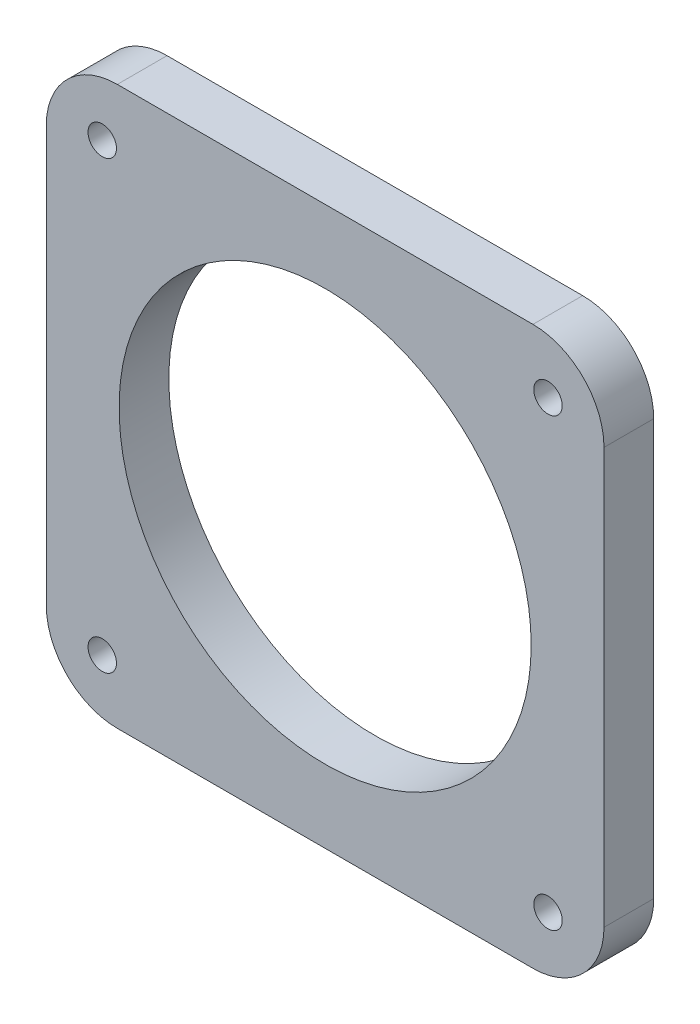
ISO-10303-21;
HEADER;
FILE_DESCRIPTION(('STEP AP214'),'2;1');
FILE_NAME('part.step','',(''),(''),'','','');
FILE_SCHEMA(('AUTOMOTIVE_DESIGN { 1 0 10303 214 1 1 1 1 }'));
ENDSEC;
DATA;
#1=APPLICATION_CONTEXT('core data for automotive mechanical design processes');
#2=APPLICATION_PROTOCOL_DEFINITION('international standard','automotive_design',2000,#1);
#3=PRODUCT_CONTEXT('',#1,'mechanical');
#4=PRODUCT('Part','Part','',(#3));
#5=PRODUCT_RELATED_PRODUCT_CATEGORY('part','',(#4));
#6=PRODUCT_DEFINITION_FORMATION('','',#4);
#7=PRODUCT_DEFINITION_CONTEXT('part definition',#1,'design');
#8=PRODUCT_DEFINITION('design','',#6,#7);
#9=PRODUCT_DEFINITION_SHAPE('','',#8);
#10=(LENGTH_UNIT() NAMED_UNIT(*) SI_UNIT(.MILLI.,.METRE.));
#11=(NAMED_UNIT(*) PLANE_ANGLE_UNIT() SI_UNIT($,.RADIAN.));
#12=(NAMED_UNIT(*) SI_UNIT($,.STERADIAN.) SOLID_ANGLE_UNIT());
#13=UNCERTAINTY_MEASURE_WITH_UNIT(LENGTH_MEASURE(1.E-05),#10,'distance_accuracy_value','');
#14=(GEOMETRIC_REPRESENTATION_CONTEXT(3) GLOBAL_UNCERTAINTY_ASSIGNED_CONTEXT((#13)) GLOBAL_UNIT_ASSIGNED_CONTEXT((#10,
#11,#12)) REPRESENTATION_CONTEXT('',''));
#15=CARTESIAN_POINT('',(0.,0.,0.));
#16=DIRECTION('',(0.,0.,1.));
#17=DIRECTION('',(1.,0.,0.));
#18=AXIS2_PLACEMENT_3D('',#15,#16,#17);
#19=CARTESIAN_POINT('',(39.25,-39.25,3.5));
#20=DIRECTION('',(-1.,0.,0.));
#21=DIRECTION('',(0.,0.,1.));
#22=AXIS2_PLACEMENT_3D('',#19,#20,#21);
#23=PLANE('',#22);
#24=DIRECTION('',(0.,1.,0.));
#25=VECTOR('',#24,1.);
#26=CARTESIAN_POINT('',(39.25,-39.25,3.5));
#27=LINE('',#26,#25);
#28=CARTESIAN_POINT('',(39.25,-29.25,3.5));
#29=VERTEX_POINT('',#28);
#30=CARTESIAN_POINT('',(39.25,29.25,3.5));
#31=VERTEX_POINT('',#30);
#32=EDGE_CURVE('E129',#29,#31,#27,.T.);
#33=ORIENTED_EDGE('',*,*,#32,.F.);
#34=DIRECTION('',(0.,0.,-1.));
#35=VECTOR('',#34,1.);
#36=CARTESIAN_POINT('',(39.25,-29.25,3.5));
#37=LINE('',#36,#35);
#38=CARTESIAN_POINT('',(39.25,-29.25,-3.5));
#39=VERTEX_POINT('',#38);
#40=EDGE_CURVE('E155',#29,#39,#37,.T.);
#41=ORIENTED_EDGE('',*,*,#40,.T.);
#42=DIRECTION('',(0.,1.,0.));
#43=VECTOR('',#42,1.);
#44=CARTESIAN_POINT('',(39.25,-39.25,-3.5));
#45=LINE('',#44,#43);
#46=CARTESIAN_POINT('',(39.25,29.25,-3.5));
#47=VERTEX_POINT('',#46);
#48=EDGE_CURVE('E161',#39,#47,#45,.T.);
#49=ORIENTED_EDGE('',*,*,#48,.T.);
#50=DIRECTION('',(0.,0.,-1.));
#51=VECTOR('',#50,1.);
#52=CARTESIAN_POINT('',(39.25,29.25,3.5));
#53=LINE('',#52,#51);
#54=EDGE_CURVE('E153',#47,#31,#53,.F.);
#55=ORIENTED_EDGE('',*,*,#54,.T.);
#56=EDGE_LOOP('',(#33,#41,#49,#55));
#57=FACE_BOUND('',#56,.T.);
#58=ADVANCED_FACE('F37',(#57),#23,.F.);
#59=CARTESIAN_POINT('',(-39.25,39.25,3.5));
#60=DIRECTION('',(0.,-1.,0.));
#61=DIRECTION('',(0.,0.,-1.));
#62=AXIS2_PLACEMENT_3D('',#59,#60,#61);
#63=PLANE('',#62);
#64=DIRECTION('',(-1.,0.,0.));
#65=VECTOR('',#64,1.);
#66=CARTESIAN_POINT('',(-39.25,39.25,3.5));
#67=LINE('',#66,#65);
#68=CARTESIAN_POINT('',(29.25,39.25,3.5));
#69=VERTEX_POINT('',#68);
#70=CARTESIAN_POINT('',(-29.25,39.25,3.5));
#71=VERTEX_POINT('',#70);
#72=EDGE_CURVE('E132',#69,#71,#67,.T.);
#73=ORIENTED_EDGE('',*,*,#72,.F.);
#74=DIRECTION('',(0.,0.,-1.));
#75=VECTOR('',#74,1.);
#76=CARTESIAN_POINT('',(29.25,39.25,3.5));
#77=LINE('',#76,#75);
#78=CARTESIAN_POINT('',(29.25,39.25,-3.5));
#79=VERTEX_POINT('',#78);
#80=EDGE_CURVE('E11',#69,#79,#77,.T.);
#81=ORIENTED_EDGE('',*,*,#80,.T.);
#82=DIRECTION('',(-1.,0.,0.));
#83=VECTOR('',#82,1.);
#84=CARTESIAN_POINT('',(-39.25,39.25,-3.5));
#85=LINE('',#84,#83);
#86=CARTESIAN_POINT('',(-29.25,39.25,-3.5));
#87=VERTEX_POINT('',#86);
#88=EDGE_CURVE('E134',#79,#87,#85,.T.);
#89=ORIENTED_EDGE('',*,*,#88,.T.);
#90=DIRECTION('',(0.,0.,-1.));
#91=VECTOR('',#90,1.);
#92=CARTESIAN_POINT('',(-29.25,39.25,3.5));
#93=LINE('',#92,#91);
#94=EDGE_CURVE('E45',#87,#71,#93,.F.);
#95=ORIENTED_EDGE('',*,*,#94,.T.);
#96=EDGE_LOOP('',(#73,#81,#89,#95));
#97=FACE_BOUND('',#96,.T.);
#98=ADVANCED_FACE('F230',(#97),#63,.F.);
#99=CARTESIAN_POINT('',(-39.25,-39.25,3.5));
#100=DIRECTION('',(1.,0.,0.));
#101=DIRECTION('',(0.,0.,-1.));
#102=AXIS2_PLACEMENT_3D('',#99,#100,#101);
#103=PLANE('',#102);
#104=DIRECTION('',(0.,-1.,0.));
#105=VECTOR('',#104,1.);
#106=CARTESIAN_POINT('',(-39.25,-39.25,-3.5));
#107=LINE('',#106,#105);
#108=CARTESIAN_POINT('',(-39.25,29.25,-3.5));
#109=VERTEX_POINT('',#108);
#110=CARTESIAN_POINT('',(-39.25,-29.25,-3.5));
#111=VERTEX_POINT('',#110);
#112=EDGE_CURVE('E130',#109,#111,#107,.T.);
#113=ORIENTED_EDGE('',*,*,#112,.T.);
#114=DIRECTION('',(0.,0.,-1.));
#115=VECTOR('',#114,1.);
#116=CARTESIAN_POINT('',(-39.25,-29.25,3.5));
#117=LINE('',#116,#115);
#118=CARTESIAN_POINT('',(-39.25,-29.25,3.5));
#119=VERTEX_POINT('',#118);
#120=EDGE_CURVE('E108',#111,#119,#117,.F.);
#121=ORIENTED_EDGE('',*,*,#120,.T.);
#122=DIRECTION('',(0.,-1.,0.));
#123=VECTOR('',#122,1.);
#124=CARTESIAN_POINT('',(-39.25,-39.25,3.5));
#125=LINE('',#124,#123);
#126=CARTESIAN_POINT('',(-39.25,29.25,3.5));
#127=VERTEX_POINT('',#126);
#128=EDGE_CURVE('E173',#127,#119,#125,.T.);
#129=ORIENTED_EDGE('',*,*,#128,.F.);
#130=DIRECTION('',(0.,0.,-1.));
#131=VECTOR('',#130,1.);
#132=CARTESIAN_POINT('',(-39.25,29.25,3.5));
#133=LINE('',#132,#131);
#134=EDGE_CURVE('E113',#127,#109,#133,.T.);
#135=ORIENTED_EDGE('',*,*,#134,.T.);
#136=EDGE_LOOP('',(#113,#121,#129,#135));
#137=FACE_BOUND('',#136,.T.);
#138=ADVANCED_FACE('F228',(#137),#103,.F.);
#139=CARTESIAN_POINT('',(-39.25,-39.25,3.5));
#140=DIRECTION('',(0.,1.,0.));
#141=DIRECTION('',(0.,0.,1.));
#142=AXIS2_PLACEMENT_3D('',#139,#140,#141);
#143=PLANE('',#142);
#144=DIRECTION('',(1.,0.,0.));
#145=VECTOR('',#144,1.);
#146=CARTESIAN_POINT('',(-39.25,-39.25,3.5));
#147=LINE('',#146,#145);
#148=CARTESIAN_POINT('',(-29.25,-39.25,3.5));
#149=VERTEX_POINT('',#148);
#150=CARTESIAN_POINT('',(29.25,-39.25,3.5));
#151=VERTEX_POINT('',#150);
#152=EDGE_CURVE('E123',#149,#151,#147,.T.);
#153=ORIENTED_EDGE('',*,*,#152,.F.);
#154=DIRECTION('',(0.,0.,-1.));
#155=VECTOR('',#154,1.);
#156=CARTESIAN_POINT('',(-29.25,-39.25,3.5));
#157=LINE('',#156,#155);
#158=CARTESIAN_POINT('',(-29.25,-39.25,-3.5));
#159=VERTEX_POINT('',#158);
#160=EDGE_CURVE('E107',#149,#159,#157,.T.);
#161=ORIENTED_EDGE('',*,*,#160,.T.);
#162=DIRECTION('',(1.,0.,0.));
#163=VECTOR('',#162,1.);
#164=CARTESIAN_POINT('',(-39.25,-39.25,-3.5));
#165=LINE('',#164,#163);
#166=CARTESIAN_POINT('',(29.25,-39.25,-3.5));
#167=VERTEX_POINT('',#166);
#168=EDGE_CURVE('E120',#159,#167,#165,.T.);
#169=ORIENTED_EDGE('',*,*,#168,.T.);
#170=DIRECTION('',(0.,0.,-1.));
#171=VECTOR('',#170,1.);
#172=CARTESIAN_POINT('',(29.25,-39.25,3.5));
#173=LINE('',#172,#171);
#174=EDGE_CURVE('E125',#167,#151,#173,.F.);
#175=ORIENTED_EDGE('',*,*,#174,.T.);
#176=EDGE_LOOP('',(#153,#161,#169,#175));
#177=FACE_BOUND('',#176,.T.);
#178=ADVANCED_FACE('F119',(#177),#143,.F.);
#179=CARTESIAN_POINT('',(0.,0.,3.5));
#180=DIRECTION('',(0.,0.,-1.));
#181=DIRECTION('',(-1.,0.,0.));
#182=AXIS2_PLACEMENT_3D('',#179,#180,#181);
#183=PLANE('',#182);
#184=CARTESIAN_POINT('',(0.,0.,3.5));
#185=DIRECTION('',(0.,0.,1.));
#186=DIRECTION('',(1.,0.,0.));
#187=AXIS2_PLACEMENT_3D('',#184,#185,#186);
#188=CIRCLE('',#187,29.);
#189=CARTESIAN_POINT('',(29.,0.,3.5));
#190=VERTEX_POINT('',#189);
#191=EDGE_CURVE('E198',#190,#190,#188,.T.);
#192=ORIENTED_EDGE('',*,*,#191,.F.);
#193=EDGE_LOOP('',(#192));
#194=FACE_BOUND('',#193,.T.);
#195=CARTESIAN_POINT('',(-31.3713203435598,-31.3713203435595,3.5));
#196=DIRECTION('',(0.,0.,1.));
#197=DIRECTION('',(-1.,0.,0.));
#198=AXIS2_PLACEMENT_3D('',#195,#196,#197);
#199=CIRCLE('',#198,2.);
#200=CARTESIAN_POINT('',(-33.3713203435598,-31.3713203435595,3.5));
#201=VERTEX_POINT('',#200);
#202=EDGE_CURVE('E178',#201,#201,#199,.T.);
#203=ORIENTED_EDGE('',*,*,#202,.F.);
#204=EDGE_LOOP('',(#203));
#205=FACE_BOUND('',#204,.T.);
#206=CARTESIAN_POINT('',(31.3713203435598,31.3713203435595,3.5));
#207=DIRECTION('',(0.,0.,1.));
#208=DIRECTION('',(-1.,0.,0.));
#209=AXIS2_PLACEMENT_3D('',#206,#207,#208);
#210=CIRCLE('',#209,2.);
#211=CARTESIAN_POINT('',(29.3713203435598,31.3713203435595,3.5));
#212=VERTEX_POINT('',#211);
#213=EDGE_CURVE('E183',#212,#212,#210,.T.);
#214=ORIENTED_EDGE('',*,*,#213,.F.);
#215=EDGE_LOOP('',(#214));
#216=FACE_BOUND('',#215,.T.);
#217=CARTESIAN_POINT('',(31.3713203435598,-31.3713203435595,3.5));
#218=DIRECTION('',(0.,0.,1.));
#219=DIRECTION('',(1.,0.,0.));
#220=AXIS2_PLACEMENT_3D('',#217,#218,#219);
#221=CIRCLE('',#220,2.);
#222=CARTESIAN_POINT('',(33.3713203435598,-31.3713203435595,3.5));
#223=VERTEX_POINT('',#222);
#224=EDGE_CURVE('E184',#223,#223,#221,.T.);
#225=ORIENTED_EDGE('',*,*,#224,.F.);
#226=EDGE_LOOP('',(#225));
#227=FACE_BOUND('',#226,.T.);
#228=CARTESIAN_POINT('',(-31.3713203435598,31.3713203435595,3.5));
#229=DIRECTION('',(0.,0.,1.));
#230=DIRECTION('',(1.,0.,0.));
#231=AXIS2_PLACEMENT_3D('',#228,#229,#230);
#232=CIRCLE('',#231,2.);
#233=CARTESIAN_POINT('',(-29.3713203435598,31.3713203435595,3.5));
#234=VERTEX_POINT('',#233);
#235=EDGE_CURVE('E169',#234,#234,#232,.T.);
#236=ORIENTED_EDGE('',*,*,#235,.F.);
#237=EDGE_LOOP('',(#236));
#238=FACE_BOUND('',#237,.T.);
#239=ORIENTED_EDGE('',*,*,#128,.T.);
#240=CARTESIAN_POINT('',(-29.25,-29.25,3.5));
#241=DIRECTION('',(0.,0.,-1.));
#242=DIRECTION('',(-1.,0.,0.));
#243=AXIS2_PLACEMENT_3D('',#240,#241,#242);
#244=CIRCLE('',#243,10.);
#245=EDGE_CURVE('E151',#119,#149,#244,.F.);
#246=ORIENTED_EDGE('',*,*,#245,.T.);
#247=ORIENTED_EDGE('',*,*,#152,.T.);
#248=CARTESIAN_POINT('',(29.25,-29.25,3.5));
#249=DIRECTION('',(0.,0.,-1.));
#250=DIRECTION('',(-1.,0.,0.));
#251=AXIS2_PLACEMENT_3D('',#248,#249,#250);
#252=CIRCLE('',#251,10.);
#253=EDGE_CURVE('E149',#151,#29,#252,.F.);
#254=ORIENTED_EDGE('',*,*,#253,.T.);
#255=ORIENTED_EDGE('',*,*,#32,.T.);
#256=CARTESIAN_POINT('',(29.25,29.25,3.5));
#257=DIRECTION('',(0.,0.,-1.));
#258=DIRECTION('',(-1.,0.,0.));
#259=AXIS2_PLACEMENT_3D('',#256,#257,#258);
#260=CIRCLE('',#259,10.);
#261=EDGE_CURVE('E58',#31,#69,#260,.F.);
#262=ORIENTED_EDGE('',*,*,#261,.T.);
#263=ORIENTED_EDGE('',*,*,#72,.T.);
#264=CARTESIAN_POINT('',(-29.25,29.25,3.5));
#265=DIRECTION('',(0.,0.,-1.));
#266=DIRECTION('',(-1.,0.,0.));
#267=AXIS2_PLACEMENT_3D('',#264,#265,#266);
#268=CIRCLE('',#267,10.);
#269=EDGE_CURVE('E146',#71,#127,#268,.F.);
#270=ORIENTED_EDGE('',*,*,#269,.T.);
#271=EDGE_LOOP('',(#239,#246,#247,#254,#255,#262,#263,#270));
#272=FACE_BOUND('',#271,.T.);
#273=ADVANCED_FACE('F213',(#194,#205,#216,#227,#238,#272),#183,.F.);
#274=CARTESIAN_POINT('',(0.,0.,-3.5));
#275=DIRECTION('',(0.,0.,-1.));
#276=DIRECTION('',(-1.,0.,0.));
#277=AXIS2_PLACEMENT_3D('',#274,#275,#276);
#278=PLANE('',#277);
#279=CARTESIAN_POINT('',(0.,0.,-3.5));
#280=DIRECTION('',(0.,0.,1.));
#281=DIRECTION('',(1.,0.,0.));
#282=AXIS2_PLACEMENT_3D('',#279,#280,#281);
#283=CIRCLE('',#282,29.);
#284=CARTESIAN_POINT('',(29.,0.,-3.5));
#285=VERTEX_POINT('',#284);
#286=EDGE_CURVE('E195',#285,#285,#283,.T.);
#287=ORIENTED_EDGE('',*,*,#286,.T.);
#288=EDGE_LOOP('',(#287));
#289=FACE_BOUND('',#288,.T.);
#290=CARTESIAN_POINT('',(-31.3713203435598,-31.3713203435595,-3.5));
#291=DIRECTION('',(0.,0.,1.));
#292=DIRECTION('',(-1.,0.,0.));
#293=AXIS2_PLACEMENT_3D('',#290,#291,#292);
#294=CIRCLE('',#293,2.);
#295=CARTESIAN_POINT('',(-33.3713203435598,-31.3713203435595,-3.5));
#296=VERTEX_POINT('',#295);
#297=EDGE_CURVE('E187',#296,#296,#294,.T.);
#298=ORIENTED_EDGE('',*,*,#297,.T.);
#299=EDGE_LOOP('',(#298));
#300=FACE_BOUND('',#299,.T.);
#301=CARTESIAN_POINT('',(31.3713203435598,31.3713203435595,-3.5));
#302=DIRECTION('',(0.,0.,1.));
#303=DIRECTION('',(-1.,0.,0.));
#304=AXIS2_PLACEMENT_3D('',#301,#302,#303);
#305=CIRCLE('',#304,2.);
#306=CARTESIAN_POINT('',(29.3713203435598,31.3713203435595,-3.5));
#307=VERTEX_POINT('',#306);
#308=EDGE_CURVE('E180',#307,#307,#305,.T.);
#309=ORIENTED_EDGE('',*,*,#308,.T.);
#310=EDGE_LOOP('',(#309));
#311=FACE_BOUND('',#310,.T.);
#312=CARTESIAN_POINT('',(31.3713203435598,-31.3713203435595,-3.5));
#313=DIRECTION('',(0.,0.,1.));
#314=DIRECTION('',(1.,0.,0.));
#315=AXIS2_PLACEMENT_3D('',#312,#313,#314);
#316=CIRCLE('',#315,2.);
#317=CARTESIAN_POINT('',(33.3713203435598,-31.3713203435595,-3.5));
#318=VERTEX_POINT('',#317);
#319=EDGE_CURVE('E192',#318,#318,#316,.T.);
#320=ORIENTED_EDGE('',*,*,#319,.T.);
#321=EDGE_LOOP('',(#320));
#322=FACE_BOUND('',#321,.T.);
#323=CARTESIAN_POINT('',(-31.3713203435598,31.3713203435595,-3.5));
#324=DIRECTION('',(0.,0.,1.));
#325=DIRECTION('',(1.,0.,0.));
#326=AXIS2_PLACEMENT_3D('',#323,#324,#325);
#327=CIRCLE('',#326,2.);
#328=CARTESIAN_POINT('',(-29.3713203435598,31.3713203435595,-3.5));
#329=VERTEX_POINT('',#328);
#330=EDGE_CURVE('E166',#329,#329,#327,.T.);
#331=ORIENTED_EDGE('',*,*,#330,.T.);
#332=EDGE_LOOP('',(#331));
#333=FACE_BOUND('',#332,.T.);
#334=ORIENTED_EDGE('',*,*,#168,.F.);
#335=CARTESIAN_POINT('',(-29.25,-29.25,-3.5));
#336=DIRECTION('',(0.,0.,-1.));
#337=DIRECTION('',(-1.,0.,0.));
#338=AXIS2_PLACEMENT_3D('',#335,#336,#337);
#339=CIRCLE('',#338,10.);
#340=EDGE_CURVE('E103',#159,#111,#339,.T.);
#341=ORIENTED_EDGE('',*,*,#340,.T.);
#342=ORIENTED_EDGE('',*,*,#112,.F.);
#343=CARTESIAN_POINT('',(-29.25,29.25,-3.5));
#344=DIRECTION('',(0.,0.,-1.));
#345=DIRECTION('',(-1.,0.,0.));
#346=AXIS2_PLACEMENT_3D('',#343,#344,#345);
#347=CIRCLE('',#346,10.);
#348=EDGE_CURVE('E124',#109,#87,#347,.T.);
#349=ORIENTED_EDGE('',*,*,#348,.T.);
#350=ORIENTED_EDGE('',*,*,#88,.F.);
#351=CARTESIAN_POINT('',(29.25,29.25,-3.5));
#352=DIRECTION('',(0.,0.,-1.));
#353=DIRECTION('',(-1.,0.,0.));
#354=AXIS2_PLACEMENT_3D('',#351,#352,#353);
#355=CIRCLE('',#354,10.);
#356=EDGE_CURVE('E140',#79,#47,#355,.T.);
#357=ORIENTED_EDGE('',*,*,#356,.T.);
#358=ORIENTED_EDGE('',*,*,#48,.F.);
#359=CARTESIAN_POINT('',(29.25,-29.25,-3.5));
#360=DIRECTION('',(0.,0.,-1.));
#361=DIRECTION('',(-1.,0.,0.));
#362=AXIS2_PLACEMENT_3D('',#359,#360,#361);
#363=CIRCLE('',#362,10.);
#364=EDGE_CURVE('E114',#39,#167,#363,.T.);
#365=ORIENTED_EDGE('',*,*,#364,.T.);
#366=EDGE_LOOP('',(#334,#341,#342,#349,#350,#357,#358,#365));
#367=FACE_BOUND('',#366,.T.);
#368=ADVANCED_FACE('F127',(#289,#300,#311,#322,#333,#367),#278,.T.);
#369=CARTESIAN_POINT('',(-29.25,-29.25,3.5));
#370=DIRECTION('',(0.,0.,-1.));
#371=DIRECTION('',(-1.,0.,0.));
#372=AXIS2_PLACEMENT_3D('',#369,#370,#371);
#373=CYLINDRICAL_SURFACE('',#372,10.);
#374=ORIENTED_EDGE('',*,*,#245,.F.);
#375=ORIENTED_EDGE('',*,*,#120,.F.);
#376=ORIENTED_EDGE('',*,*,#340,.F.);
#377=ORIENTED_EDGE('',*,*,#160,.F.);
#378=EDGE_LOOP('',(#374,#375,#376,#377));
#379=FACE_BOUND('',#378,.T.);
#380=ADVANCED_FACE('F106',(#379),#373,.T.);
#381=CARTESIAN_POINT('',(29.25,-29.25,3.5));
#382=DIRECTION('',(0.,0.,-1.));
#383=DIRECTION('',(-1.,0.,0.));
#384=AXIS2_PLACEMENT_3D('',#381,#382,#383);
#385=CYLINDRICAL_SURFACE('',#384,10.);
#386=ORIENTED_EDGE('',*,*,#253,.F.);
#387=ORIENTED_EDGE('',*,*,#174,.F.);
#388=ORIENTED_EDGE('',*,*,#364,.F.);
#389=ORIENTED_EDGE('',*,*,#40,.F.);
#390=EDGE_LOOP('',(#386,#387,#388,#389));
#391=FACE_BOUND('',#390,.T.);
#392=ADVANCED_FACE('F234',(#391),#385,.T.);
#393=CARTESIAN_POINT('',(29.25,29.25,3.5));
#394=DIRECTION('',(0.,0.,-1.));
#395=DIRECTION('',(-1.,0.,0.));
#396=AXIS2_PLACEMENT_3D('',#393,#394,#395);
#397=CYLINDRICAL_SURFACE('',#396,10.);
#398=ORIENTED_EDGE('',*,*,#261,.F.);
#399=ORIENTED_EDGE('',*,*,#54,.F.);
#400=ORIENTED_EDGE('',*,*,#356,.F.);
#401=ORIENTED_EDGE('',*,*,#80,.F.);
#402=EDGE_LOOP('',(#398,#399,#400,#401));
#403=FACE_BOUND('',#402,.T.);
#404=ADVANCED_FACE('F233',(#403),#397,.T.);
#405=CARTESIAN_POINT('',(-29.25,29.25,3.5));
#406=DIRECTION('',(0.,0.,-1.));
#407=DIRECTION('',(-1.,0.,0.));
#408=AXIS2_PLACEMENT_3D('',#405,#406,#407);
#409=CYLINDRICAL_SURFACE('',#408,10.);
#410=ORIENTED_EDGE('',*,*,#269,.F.);
#411=ORIENTED_EDGE('',*,*,#94,.F.);
#412=ORIENTED_EDGE('',*,*,#348,.F.);
#413=ORIENTED_EDGE('',*,*,#134,.F.);
#414=EDGE_LOOP('',(#410,#411,#412,#413));
#415=FACE_BOUND('',#414,.T.);
#416=ADVANCED_FACE('F39',(#415),#409,.T.);
#417=CARTESIAN_POINT('',(-31.3713203435598,31.3713203435595,-3.5));
#418=DIRECTION('',(0.,0.,1.));
#419=DIRECTION('',(1.,0.,0.));
#420=AXIS2_PLACEMENT_3D('',#417,#418,#419);
#421=CYLINDRICAL_SURFACE('',#420,2.);
#422=ORIENTED_EDGE('',*,*,#330,.F.);
#423=EDGE_LOOP('',(#422));
#424=FACE_BOUND('',#423,.T.);
#425=ORIENTED_EDGE('',*,*,#235,.T.);
#426=EDGE_LOOP('',(#425));
#427=FACE_BOUND('',#426,.T.);
#428=ADVANCED_FACE('F255',(#424,#427),#421,.F.);
#429=CARTESIAN_POINT('',(31.3713203435598,-31.3713203435595,-3.5));
#430=DIRECTION('',(0.,0.,1.));
#431=DIRECTION('',(1.,0.,0.));
#432=AXIS2_PLACEMENT_3D('',#429,#430,#431);
#433=CYLINDRICAL_SURFACE('',#432,2.);
#434=ORIENTED_EDGE('',*,*,#319,.F.);
#435=EDGE_LOOP('',(#434));
#436=FACE_BOUND('',#435,.T.);
#437=ORIENTED_EDGE('',*,*,#224,.T.);
#438=EDGE_LOOP('',(#437));
#439=FACE_BOUND('',#438,.T.);
#440=ADVANCED_FACE('F258',(#436,#439),#433,.F.);
#441=CARTESIAN_POINT('',(31.3713203435598,31.3713203435595,-3.5));
#442=DIRECTION('',(0.,0.,1.));
#443=DIRECTION('',(1.,0.,0.));
#444=AXIS2_PLACEMENT_3D('',#441,#442,#443);
#445=CYLINDRICAL_SURFACE('',#444,2.);
#446=ORIENTED_EDGE('',*,*,#308,.F.);
#447=EDGE_LOOP('',(#446));
#448=FACE_BOUND('',#447,.T.);
#449=ORIENTED_EDGE('',*,*,#213,.T.);
#450=EDGE_LOOP('',(#449));
#451=FACE_BOUND('',#450,.T.);
#452=ADVANCED_FACE('F260',(#448,#451),#445,.F.);
#453=CARTESIAN_POINT('',(-31.3713203435598,-31.3713203435595,-3.5));
#454=DIRECTION('',(0.,0.,1.));
#455=DIRECTION('',(1.,0.,0.));
#456=AXIS2_PLACEMENT_3D('',#453,#454,#455);
#457=CYLINDRICAL_SURFACE('',#456,2.);
#458=ORIENTED_EDGE('',*,*,#297,.F.);
#459=EDGE_LOOP('',(#458));
#460=FACE_BOUND('',#459,.T.);
#461=ORIENTED_EDGE('',*,*,#202,.T.);
#462=EDGE_LOOP('',(#461));
#463=FACE_BOUND('',#462,.T.);
#464=ADVANCED_FACE('F209',(#460,#463),#457,.F.);
#465=CARTESIAN_POINT('',(0.,0.,-3.5));
#466=DIRECTION('',(0.,0.,1.));
#467=DIRECTION('',(1.,0.,0.));
#468=AXIS2_PLACEMENT_3D('',#465,#466,#467);
#469=CYLINDRICAL_SURFACE('',#468,29.);
#470=ORIENTED_EDGE('',*,*,#286,.F.);
#471=EDGE_LOOP('',(#470));
#472=FACE_BOUND('',#471,.T.);
#473=ORIENTED_EDGE('',*,*,#191,.T.);
#474=EDGE_LOOP('',(#473));
#475=FACE_BOUND('',#474,.T.);
#476=ADVANCED_FACE('F206',(#472,#475),#469,.F.);
#477=CLOSED_SHELL('',(#58,#98,#138,#178,#273,#368,#380,#392,#404,#416,#428,#440,#452,#464,#476));
#478=MANIFOLD_SOLID_BREP('B2',#477);
#479=ADVANCED_BREP_SHAPE_REPRESENTATION('',(#18,#478),#14);
#480=SHAPE_DEFINITION_REPRESENTATION(#9,#479);
ENDSEC;
END-ISO-10303-21;
